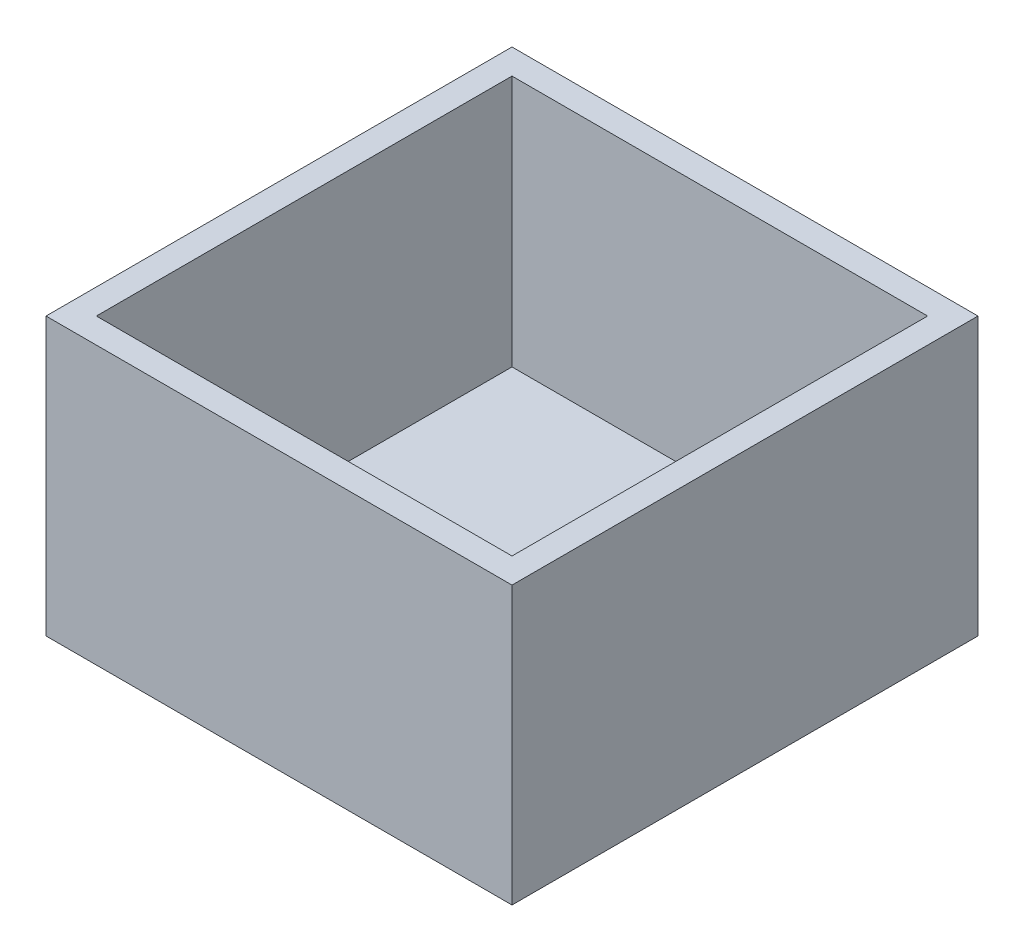
ISO-10303-21;
HEADER;
FILE_DESCRIPTION(('STEP AP214'),'2;1');
FILE_NAME('part.step','',(''),(''),'','','');
FILE_SCHEMA(('AUTOMOTIVE_DESIGN { 1 0 10303 214 1 1 1 1 }'));
ENDSEC;
DATA;
#1=APPLICATION_CONTEXT('core data for automotive mechanical design processes');
#2=APPLICATION_PROTOCOL_DEFINITION('international standard','automotive_design',2000,#1);
#3=PRODUCT_CONTEXT('',#1,'mechanical');
#4=PRODUCT('Part','Part','',(#3));
#5=PRODUCT_RELATED_PRODUCT_CATEGORY('part','',(#4));
#6=PRODUCT_DEFINITION_FORMATION('','',#4);
#7=PRODUCT_DEFINITION_CONTEXT('part definition',#1,'design');
#8=PRODUCT_DEFINITION('design','',#6,#7);
#9=PRODUCT_DEFINITION_SHAPE('','',#8);
#10=(LENGTH_UNIT() NAMED_UNIT(*) SI_UNIT(.MILLI.,.METRE.));
#11=(NAMED_UNIT(*) PLANE_ANGLE_UNIT() SI_UNIT($,.RADIAN.));
#12=(NAMED_UNIT(*) SI_UNIT($,.STERADIAN.) SOLID_ANGLE_UNIT());
#13=UNCERTAINTY_MEASURE_WITH_UNIT(LENGTH_MEASURE(1.E-05),#10,'distance_accuracy_value','');
#14=(GEOMETRIC_REPRESENTATION_CONTEXT(3) GLOBAL_UNCERTAINTY_ASSIGNED_CONTEXT((#13)) GLOBAL_UNIT_ASSIGNED_CONTEXT((#10,
#11,#12)) REPRESENTATION_CONTEXT('',''));
#15=CARTESIAN_POINT('',(0.,0.,0.));
#16=DIRECTION('',(0.,0.,1.));
#17=DIRECTION('',(1.,0.,0.));
#18=AXIS2_PLACEMENT_3D('',#15,#16,#17);
#19=CARTESIAN_POINT('',(-5.,55.,-5.00000000000002));
#20=DIRECTION('',(1.,0.,0.));
#21=DIRECTION('',(0.,0.,-1.));
#22=AXIS2_PLACEMENT_3D('',#19,#20,#21);
#23=PLANE('',#22);
#24=DIRECTION('',(0.,0.,1.));
#25=VECTOR('',#24,1.);
#26=CARTESIAN_POINT('',(-5.,0.,-5.00000000000002));
#27=LINE('',#26,#25);
#28=CARTESIAN_POINT('',(-5.,0.,-5.00000000000002));
#29=VERTEX_POINT('',#28);
#30=CARTESIAN_POINT('',(-4.99999999999998,0.,87.5));
#31=VERTEX_POINT('',#30);
#32=EDGE_CURVE('E141',#29,#31,#27,.T.);
#33=ORIENTED_EDGE('',*,*,#32,.T.);
#34=DIRECTION('',(0.,-1.,0.));
#35=VECTOR('',#34,1.);
#36=CARTESIAN_POINT('',(-4.99999999999998,55.,87.5));
#37=LINE('',#36,#35);
#38=CARTESIAN_POINT('',(-4.99999999999998,55.,87.5));
#39=VERTEX_POINT('',#38);
#40=EDGE_CURVE('E11',#39,#31,#37,.T.);
#41=ORIENTED_EDGE('',*,*,#40,.F.);
#42=DIRECTION('',(0.,0.,1.));
#43=VECTOR('',#42,1.);
#44=CARTESIAN_POINT('',(-5.,55.,-5.00000000000002));
#45=LINE('',#44,#43);
#46=CARTESIAN_POINT('',(-5.,55.,-5.00000000000002));
#47=VERTEX_POINT('',#46);
#48=EDGE_CURVE('E145',#47,#39,#45,.T.);
#49=ORIENTED_EDGE('',*,*,#48,.F.);
#50=DIRECTION('',(0.,-1.,0.));
#51=VECTOR('',#50,1.);
#52=CARTESIAN_POINT('',(-5.,55.,-5.00000000000002));
#53=LINE('',#52,#51);
#54=EDGE_CURVE('E151',#47,#29,#53,.T.);
#55=ORIENTED_EDGE('',*,*,#54,.T.);
#56=EDGE_LOOP('',(#33,#41,#49,#55));
#57=FACE_BOUND('',#56,.T.);
#58=ADVANCED_FACE('F33',(#57),#23,.F.);
#59=CARTESIAN_POINT('',(-4.99999999999998,55.,87.5));
#60=DIRECTION('',(0.,0.,-1.));
#61=DIRECTION('',(-1.,0.,0.));
#62=AXIS2_PLACEMENT_3D('',#59,#60,#61);
#63=PLANE('',#62);
#64=DIRECTION('',(1.,0.,0.));
#65=VECTOR('',#64,1.);
#66=CARTESIAN_POINT('',(-4.99999999999998,0.,87.5));
#67=LINE('',#66,#65);
#68=CARTESIAN_POINT('',(87.5,0.,87.5));
#69=VERTEX_POINT('',#68);
#70=EDGE_CURVE('E154',#31,#69,#67,.T.);
#71=ORIENTED_EDGE('',*,*,#70,.T.);
#72=DIRECTION('',(0.,-1.,0.));
#73=VECTOR('',#72,1.);
#74=CARTESIAN_POINT('',(87.5,55.,87.5));
#75=LINE('',#74,#73);
#76=CARTESIAN_POINT('',(87.5,55.,87.5));
#77=VERTEX_POINT('',#76);
#78=EDGE_CURVE('E40',#77,#69,#75,.T.);
#79=ORIENTED_EDGE('',*,*,#78,.F.);
#80=DIRECTION('',(1.,0.,0.));
#81=VECTOR('',#80,1.);
#82=CARTESIAN_POINT('',(-4.99999999999998,55.,87.5));
#83=LINE('',#82,#81);
#84=EDGE_CURVE('E84',#39,#77,#83,.T.);
#85=ORIENTED_EDGE('',*,*,#84,.F.);
#86=ORIENTED_EDGE('',*,*,#40,.T.);
#87=EDGE_LOOP('',(#71,#79,#85,#86));
#88=FACE_BOUND('',#87,.T.);
#89=ADVANCED_FACE('F183',(#88),#63,.F.);
#90=CARTESIAN_POINT('',(87.5,55.,-5.00000000000003));
#91=DIRECTION('',(-1.,0.,0.));
#92=DIRECTION('',(0.,0.,1.));
#93=AXIS2_PLACEMENT_3D('',#90,#91,#92);
#94=PLANE('',#93);
#95=DIRECTION('',(0.,0.,-1.));
#96=VECTOR('',#95,1.);
#97=CARTESIAN_POINT('',(87.5,0.,-5.00000000000003));
#98=LINE('',#97,#96);
#99=CARTESIAN_POINT('',(87.5,0.,-5.00000000000003));
#100=VERTEX_POINT('',#99);
#101=EDGE_CURVE('E156',#69,#100,#98,.T.);
#102=ORIENTED_EDGE('',*,*,#101,.T.);
#103=DIRECTION('',(0.,-1.,0.));
#104=VECTOR('',#103,1.);
#105=CARTESIAN_POINT('',(87.5,55.,-5.00000000000003));
#106=LINE('',#105,#104);
#107=CARTESIAN_POINT('',(87.5,55.,-5.00000000000003));
#108=VERTEX_POINT('',#107);
#109=EDGE_CURVE('E160',#108,#100,#106,.T.);
#110=ORIENTED_EDGE('',*,*,#109,.F.);
#111=DIRECTION('',(0.,0.,-1.));
#112=VECTOR('',#111,1.);
#113=CARTESIAN_POINT('',(87.5,55.,-5.00000000000003));
#114=LINE('',#113,#112);
#115=EDGE_CURVE('E148',#77,#108,#114,.T.);
#116=ORIENTED_EDGE('',*,*,#115,.F.);
#117=ORIENTED_EDGE('',*,*,#78,.T.);
#118=EDGE_LOOP('',(#102,#110,#116,#117));
#119=FACE_BOUND('',#118,.T.);
#120=ADVANCED_FACE('F165',(#119),#94,.F.);
#121=CARTESIAN_POINT('',(-5.,55.,-5.00000000000002));
#122=DIRECTION('',(0.,0.,1.));
#123=DIRECTION('',(1.,0.,0.));
#124=AXIS2_PLACEMENT_3D('',#121,#122,#123);
#125=PLANE('',#124);
#126=DIRECTION('',(-1.,0.,0.));
#127=VECTOR('',#126,1.);
#128=CARTESIAN_POINT('',(-5.,0.,-5.00000000000002));
#129=LINE('',#128,#127);
#130=EDGE_CURVE('E77',#100,#29,#129,.T.);
#131=ORIENTED_EDGE('',*,*,#130,.T.);
#132=ORIENTED_EDGE('',*,*,#54,.F.);
#133=DIRECTION('',(-1.,0.,0.));
#134=VECTOR('',#133,1.);
#135=CARTESIAN_POINT('',(-5.,55.,-5.00000000000002));
#136=LINE('',#135,#134);
#137=EDGE_CURVE('E56',#108,#47,#136,.T.);
#138=ORIENTED_EDGE('',*,*,#137,.F.);
#139=ORIENTED_EDGE('',*,*,#109,.T.);
#140=EDGE_LOOP('',(#131,#132,#138,#139));
#141=FACE_BOUND('',#140,.T.);
#142=ADVANCED_FACE('F173',(#141),#125,.F.);
#143=CARTESIAN_POINT('',(0.,55.,0.));
#144=DIRECTION('',(0.,1.,0.));
#145=DIRECTION('',(0.,0.,1.));
#146=AXIS2_PLACEMENT_3D('',#143,#144,#145);
#147=PLANE('',#146);
#148=DIRECTION('',(0.,0.,1.));
#149=VECTOR('',#148,1.);
#150=CARTESIAN_POINT('',(0.,55.,0.));
#151=LINE('',#150,#149);
#152=CARTESIAN_POINT('',(0.,55.,0.));
#153=VERTEX_POINT('',#152);
#154=CARTESIAN_POINT('',(0.,55.,82.5));
#155=VERTEX_POINT('',#154);
#156=EDGE_CURVE('E47',#153,#155,#151,.T.);
#157=ORIENTED_EDGE('',*,*,#156,.F.);
#158=DIRECTION('',(-1.,0.,0.));
#159=VECTOR('',#158,1.);
#160=CARTESIAN_POINT('',(0.,55.,0.));
#161=LINE('',#160,#159);
#162=CARTESIAN_POINT('',(82.5,55.,0.));
#163=VERTEX_POINT('',#162);
#164=EDGE_CURVE('E126',#163,#153,#161,.T.);
#165=ORIENTED_EDGE('',*,*,#164,.F.);
#166=DIRECTION('',(0.,0.,-1.));
#167=VECTOR('',#166,1.);
#168=CARTESIAN_POINT('',(82.5,55.,0.));
#169=LINE('',#168,#167);
#170=CARTESIAN_POINT('',(82.5,55.,82.5));
#171=VERTEX_POINT('',#170);
#172=EDGE_CURVE('E129',#171,#163,#169,.T.);
#173=ORIENTED_EDGE('',*,*,#172,.F.);
#174=DIRECTION('',(1.,0.,0.));
#175=VECTOR('',#174,1.);
#176=CARTESIAN_POINT('',(0.,55.,82.5));
#177=LINE('',#176,#175);
#178=EDGE_CURVE('E135',#155,#171,#177,.T.);
#179=ORIENTED_EDGE('',*,*,#178,.F.);
#180=EDGE_LOOP('',(#157,#165,#173,#179));
#181=FACE_BOUND('',#180,.T.);
#182=ORIENTED_EDGE('',*,*,#48,.T.);
#183=ORIENTED_EDGE('',*,*,#84,.T.);
#184=ORIENTED_EDGE('',*,*,#115,.T.);
#185=ORIENTED_EDGE('',*,*,#137,.T.);
#186=EDGE_LOOP('',(#182,#183,#184,#185));
#187=FACE_BOUND('',#186,.T.);
#188=ADVANCED_FACE('F175',(#181,#187),#147,.T.);
#189=CARTESIAN_POINT('',(0.,0.,0.));
#190=DIRECTION('',(0.,1.,0.));
#191=DIRECTION('',(0.,0.,1.));
#192=AXIS2_PLACEMENT_3D('',#189,#190,#191);
#193=PLANE('',#192);
#194=ORIENTED_EDGE('',*,*,#32,.F.);
#195=ORIENTED_EDGE('',*,*,#130,.F.);
#196=ORIENTED_EDGE('',*,*,#101,.F.);
#197=ORIENTED_EDGE('',*,*,#70,.F.);
#198=EDGE_LOOP('',(#194,#195,#196,#197));
#199=FACE_BOUND('',#198,.T.);
#200=ADVANCED_FACE('F169',(#199),#193,.F.);
#201=CARTESIAN_POINT('',(0.,5.,0.));
#202=DIRECTION('',(-1.,0.,0.));
#203=DIRECTION('',(0.,0.,1.));
#204=AXIS2_PLACEMENT_3D('',#201,#202,#203);
#205=PLANE('',#204);
#206=ORIENTED_EDGE('',*,*,#156,.T.);
#207=DIRECTION('',(0.,1.,0.));
#208=VECTOR('',#207,1.);
#209=CARTESIAN_POINT('',(0.,5.,82.5));
#210=LINE('',#209,#208);
#211=CARTESIAN_POINT('',(0.,5.,82.5));
#212=VERTEX_POINT('',#211);
#213=EDGE_CURVE('E104',#212,#155,#210,.T.);
#214=ORIENTED_EDGE('',*,*,#213,.F.);
#215=DIRECTION('',(0.,0.,1.));
#216=VECTOR('',#215,1.);
#217=CARTESIAN_POINT('',(0.,5.,0.));
#218=LINE('',#217,#216);
#219=CARTESIAN_POINT('',(0.,5.,0.));
#220=VERTEX_POINT('',#219);
#221=EDGE_CURVE('E108',#220,#212,#218,.T.);
#222=ORIENTED_EDGE('',*,*,#221,.F.);
#223=DIRECTION('',(0.,1.,0.));
#224=VECTOR('',#223,1.);
#225=CARTESIAN_POINT('',(0.,5.,0.));
#226=LINE('',#225,#224);
#227=EDGE_CURVE('E139',#220,#153,#226,.T.);
#228=ORIENTED_EDGE('',*,*,#227,.T.);
#229=EDGE_LOOP('',(#206,#214,#222,#228));
#230=FACE_BOUND('',#229,.T.);
#231=ADVANCED_FACE('F106',(#230),#205,.F.);
#232=CARTESIAN_POINT('',(0.,5.,0.));
#233=DIRECTION('',(0.,0.,-1.));
#234=DIRECTION('',(-1.,0.,0.));
#235=AXIS2_PLACEMENT_3D('',#232,#233,#234);
#236=PLANE('',#235);
#237=ORIENTED_EDGE('',*,*,#164,.T.);
#238=ORIENTED_EDGE('',*,*,#227,.F.);
#239=DIRECTION('',(-1.,0.,0.));
#240=VECTOR('',#239,1.);
#241=CARTESIAN_POINT('',(0.,5.,0.));
#242=LINE('',#241,#240);
#243=CARTESIAN_POINT('',(82.5,5.,0.));
#244=VERTEX_POINT('',#243);
#245=EDGE_CURVE('E114',#244,#220,#242,.T.);
#246=ORIENTED_EDGE('',*,*,#245,.F.);
#247=DIRECTION('',(0.,1.,0.));
#248=VECTOR('',#247,1.);
#249=CARTESIAN_POINT('',(82.5,5.,0.));
#250=LINE('',#249,#248);
#251=EDGE_CURVE('E142',#244,#163,#250,.T.);
#252=ORIENTED_EDGE('',*,*,#251,.T.);
#253=EDGE_LOOP('',(#237,#238,#246,#252));
#254=FACE_BOUND('',#253,.T.);
#255=ADVANCED_FACE('F222',(#254),#236,.F.);
#256=CARTESIAN_POINT('',(82.5,5.,0.));
#257=DIRECTION('',(1.,0.,0.));
#258=DIRECTION('',(0.,0.,-1.));
#259=AXIS2_PLACEMENT_3D('',#256,#257,#258);
#260=PLANE('',#259);
#261=ORIENTED_EDGE('',*,*,#172,.T.);
#262=ORIENTED_EDGE('',*,*,#251,.F.);
#263=DIRECTION('',(0.,0.,-1.));
#264=VECTOR('',#263,1.);
#265=CARTESIAN_POINT('',(82.5,5.,0.));
#266=LINE('',#265,#264);
#267=CARTESIAN_POINT('',(82.5,5.,82.5));
#268=VERTEX_POINT('',#267);
#269=EDGE_CURVE('E122',#268,#244,#266,.T.);
#270=ORIENTED_EDGE('',*,*,#269,.F.);
#271=DIRECTION('',(0.,1.,0.));
#272=VECTOR('',#271,1.);
#273=CARTESIAN_POINT('',(82.5,5.,82.5));
#274=LINE('',#273,#272);
#275=EDGE_CURVE('E113',#268,#171,#274,.T.);
#276=ORIENTED_EDGE('',*,*,#275,.T.);
#277=EDGE_LOOP('',(#261,#262,#270,#276));
#278=FACE_BOUND('',#277,.T.);
#279=ADVANCED_FACE('F231',(#278),#260,.F.);
#280=CARTESIAN_POINT('',(0.,5.,82.5));
#281=DIRECTION('',(0.,0.,1.));
#282=DIRECTION('',(1.,0.,0.));
#283=AXIS2_PLACEMENT_3D('',#280,#281,#282);
#284=PLANE('',#283);
#285=ORIENTED_EDGE('',*,*,#178,.T.);
#286=ORIENTED_EDGE('',*,*,#275,.F.);
#287=DIRECTION('',(1.,0.,0.));
#288=VECTOR('',#287,1.);
#289=CARTESIAN_POINT('',(0.,5.,82.5));
#290=LINE('',#289,#288);
#291=EDGE_CURVE('E117',#212,#268,#290,.T.);
#292=ORIENTED_EDGE('',*,*,#291,.F.);
#293=ORIENTED_EDGE('',*,*,#213,.T.);
#294=EDGE_LOOP('',(#285,#286,#292,#293));
#295=FACE_BOUND('',#294,.T.);
#296=ADVANCED_FACE('F118',(#295),#284,.F.);
#297=CARTESIAN_POINT('',(0.,5.,0.));
#298=DIRECTION('',(0.,1.,0.));
#299=DIRECTION('',(0.,0.,1.));
#300=AXIS2_PLACEMENT_3D('',#297,#298,#299);
#301=PLANE('',#300);
#302=ORIENTED_EDGE('',*,*,#221,.T.);
#303=ORIENTED_EDGE('',*,*,#291,.T.);
#304=ORIENTED_EDGE('',*,*,#269,.T.);
#305=ORIENTED_EDGE('',*,*,#245,.T.);
#306=EDGE_LOOP('',(#302,#303,#304,#305));
#307=FACE_BOUND('',#306,.T.);
#308=ADVANCED_FACE('F124',(#307),#301,.T.);
#309=CLOSED_SHELL('',(#58,#89,#120,#142,#188,#200,#231,#255,#279,#296,#308));
#310=MANIFOLD_SOLID_BREP('B2',#309);
#311=ADVANCED_BREP_SHAPE_REPRESENTATION('',(#18,#310),#14);
#312=SHAPE_DEFINITION_REPRESENTATION(#9,#311);
ENDSEC;
END-ISO-10303-21;
